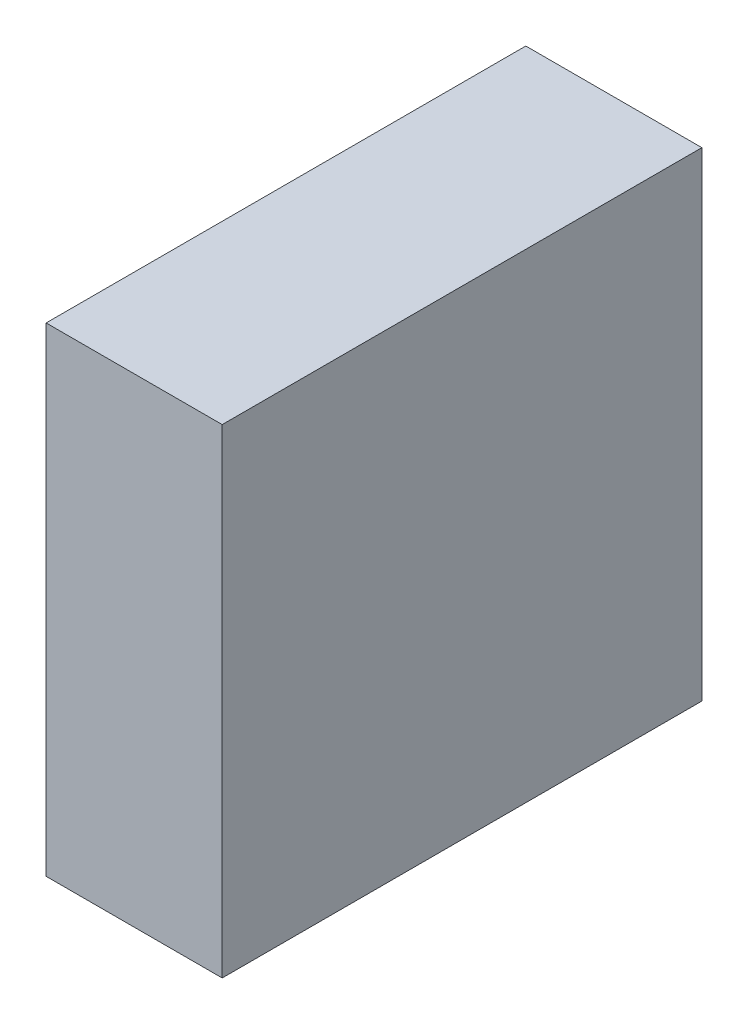
ISO-10303-21;
HEADER;
FILE_DESCRIPTION(('STEP AP214'),'2;1');
FILE_NAME('part.step','',(''),(''),'','','');
FILE_SCHEMA(('AUTOMOTIVE_DESIGN { 1 0 10303 214 1 1 1 1 }'));
ENDSEC;
DATA;
#1=APPLICATION_CONTEXT('core data for automotive mechanical design processes');
#2=APPLICATION_PROTOCOL_DEFINITION('international standard','automotive_design',2000,#1);
#3=PRODUCT_CONTEXT('',#1,'mechanical');
#4=PRODUCT('Part','Part','',(#3));
#5=PRODUCT_RELATED_PRODUCT_CATEGORY('part','',(#4));
#6=PRODUCT_DEFINITION_FORMATION('','',#4);
#7=PRODUCT_DEFINITION_CONTEXT('part definition',#1,'design');
#8=PRODUCT_DEFINITION('design','',#6,#7);
#9=PRODUCT_DEFINITION_SHAPE('','',#8);
#10=(LENGTH_UNIT() NAMED_UNIT(*) SI_UNIT(.MILLI.,.METRE.));
#11=(NAMED_UNIT(*) PLANE_ANGLE_UNIT() SI_UNIT($,.RADIAN.));
#12=(NAMED_UNIT(*) SI_UNIT($,.STERADIAN.) SOLID_ANGLE_UNIT());
#13=UNCERTAINTY_MEASURE_WITH_UNIT(LENGTH_MEASURE(1.E-05),#10,'distance_accuracy_value','');
#14=(GEOMETRIC_REPRESENTATION_CONTEXT(3) GLOBAL_UNCERTAINTY_ASSIGNED_CONTEXT((#13)) GLOBAL_UNIT_ASSIGNED_CONTEXT((#10,
#11,#12)) REPRESENTATION_CONTEXT('',''));
#15=CARTESIAN_POINT('',(0.,0.,0.));
#16=DIRECTION('',(0.,0.,1.));
#17=DIRECTION('',(1.,0.,0.));
#18=AXIS2_PLACEMENT_3D('',#15,#16,#17);
#19=CARTESIAN_POINT('',(1.003,-0.622,0.));
#20=DIRECTION('',(1.,0.,0.));
#21=DIRECTION('',(0.,0.,-1.));
#22=AXIS2_PLACEMENT_3D('',#19,#20,#21);
#23=PLANE('',#22);
#24=DIRECTION('',(0.,1.,0.));
#25=VECTOR('',#24,1.);
#26=CARTESIAN_POINT('',(1.003,-0.622,1.245));
#27=LINE('',#26,#25);
#28=CARTESIAN_POINT('',(1.003,-0.622,1.245));
#29=VERTEX_POINT('',#28);
#30=CARTESIAN_POINT('',(1.003,0.622,1.245));
#31=VERTEX_POINT('',#30);
#32=EDGE_CURVE('E68',#29,#31,#27,.T.);
#33=ORIENTED_EDGE('',*,*,#32,.F.);
#34=DIRECTION('',(0.,0.,-1.));
#35=VECTOR('',#34,1.);
#36=CARTESIAN_POINT('',(1.003,-0.622,0.));
#37=LINE('',#36,#35);
#38=CARTESIAN_POINT('',(1.003,-0.622,0.));
#39=VERTEX_POINT('',#38);
#40=EDGE_CURVE('E55',#39,#29,#37,.F.);
#41=ORIENTED_EDGE('',*,*,#40,.F.);
#42=DIRECTION('',(0.,1.,0.));
#43=VECTOR('',#42,1.);
#44=CARTESIAN_POINT('',(1.003,0.622,0.));
#45=LINE('',#44,#43);
#46=CARTESIAN_POINT('',(1.003,0.622,0.));
#47=VERTEX_POINT('',#46);
#48=EDGE_CURVE('E20',#47,#39,#45,.F.);
#49=ORIENTED_EDGE('',*,*,#48,.F.);
#50=DIRECTION('',(0.,0.,1.));
#51=VECTOR('',#50,1.);
#52=CARTESIAN_POINT('',(1.003,0.622,0.));
#53=LINE('',#52,#51);
#54=EDGE_CURVE('E81',#31,#47,#53,.F.);
#55=ORIENTED_EDGE('',*,*,#54,.F.);
#56=EDGE_LOOP('',(#33,#41,#49,#55));
#57=FACE_BOUND('',#56,.T.);
#58=ADVANCED_FACE('F17',(#57),#23,.T.);
#59=CARTESIAN_POINT('',(0.546,0.622,0.));
#60=DIRECTION('',(0.,0.,-1.));
#61=DIRECTION('',(-1.,0.,0.));
#62=AXIS2_PLACEMENT_3D('',#59,#60,#61);
#63=PLANE('',#62);
#64=DIRECTION('',(1.,0.,0.));
#65=VECTOR('',#64,1.);
#66=CARTESIAN_POINT('',(0.546,-0.622,0.));
#67=LINE('',#66,#65);
#68=CARTESIAN_POINT('',(0.546,-0.622,0.));
#69=VERTEX_POINT('',#68);
#70=EDGE_CURVE('E61',#69,#39,#67,.T.);
#71=ORIENTED_EDGE('',*,*,#70,.F.);
#72=DIRECTION('',(0.,1.,0.));
#73=VECTOR('',#72,1.);
#74=CARTESIAN_POINT('',(0.546,0.622,0.));
#75=LINE('',#74,#73);
#76=CARTESIAN_POINT('',(0.546,0.622,0.));
#77=VERTEX_POINT('',#76);
#78=EDGE_CURVE('E83',#77,#69,#75,.F.);
#79=ORIENTED_EDGE('',*,*,#78,.F.);
#80=DIRECTION('',(1.,0.,0.));
#81=VECTOR('',#80,1.);
#82=CARTESIAN_POINT('',(1.003,0.622,0.));
#83=LINE('',#82,#81);
#84=EDGE_CURVE('E64',#47,#77,#83,.F.);
#85=ORIENTED_EDGE('',*,*,#84,.F.);
#86=ORIENTED_EDGE('',*,*,#48,.T.);
#87=EDGE_LOOP('',(#71,#79,#85,#86));
#88=FACE_BOUND('',#87,.T.);
#89=ADVANCED_FACE('F60',(#88),#63,.T.);
#90=CARTESIAN_POINT('',(0.546,-0.622,0.));
#91=DIRECTION('',(0.,-1.,0.));
#92=DIRECTION('',(0.,0.,-1.));
#93=AXIS2_PLACEMENT_3D('',#90,#91,#92);
#94=PLANE('',#93);
#95=DIRECTION('',(1.,0.,0.));
#96=VECTOR('',#95,1.);
#97=CARTESIAN_POINT('',(0.546,-0.622,1.245));
#98=LINE('',#97,#96);
#99=CARTESIAN_POINT('',(0.546,-0.622,1.245));
#100=VERTEX_POINT('',#99);
#101=EDGE_CURVE('E70',#100,#29,#98,.T.);
#102=ORIENTED_EDGE('',*,*,#101,.F.);
#103=DIRECTION('',(0.,0.,1.));
#104=VECTOR('',#103,1.);
#105=CARTESIAN_POINT('',(0.546,-0.622,0.));
#106=LINE('',#105,#104);
#107=EDGE_CURVE('E74',#69,#100,#106,.T.);
#108=ORIENTED_EDGE('',*,*,#107,.F.);
#109=ORIENTED_EDGE('',*,*,#70,.T.);
#110=ORIENTED_EDGE('',*,*,#40,.T.);
#111=EDGE_LOOP('',(#102,#108,#109,#110));
#112=FACE_BOUND('',#111,.T.);
#113=ADVANCED_FACE('F72',(#112),#94,.T.);
#114=CARTESIAN_POINT('',(0.546,-0.622,1.245));
#115=DIRECTION('',(0.,0.,1.));
#116=DIRECTION('',(1.,0.,0.));
#117=AXIS2_PLACEMENT_3D('',#114,#115,#116);
#118=PLANE('',#117);
#119=DIRECTION('',(1.,0.,0.));
#120=VECTOR('',#119,1.);
#121=CARTESIAN_POINT('',(1.003,0.622,1.245));
#122=LINE('',#121,#120);
#123=CARTESIAN_POINT('',(0.546,0.622,1.245));
#124=VERTEX_POINT('',#123);
#125=EDGE_CURVE('E35',#124,#31,#122,.T.);
#126=ORIENTED_EDGE('',*,*,#125,.F.);
#127=DIRECTION('',(0.,1.,0.));
#128=VECTOR('',#127,1.);
#129=CARTESIAN_POINT('',(0.546,0.622,1.245));
#130=LINE('',#129,#128);
#131=EDGE_CURVE('E26',#100,#124,#130,.T.);
#132=ORIENTED_EDGE('',*,*,#131,.F.);
#133=ORIENTED_EDGE('',*,*,#101,.T.);
#134=ORIENTED_EDGE('',*,*,#32,.T.);
#135=EDGE_LOOP('',(#126,#132,#133,#134));
#136=FACE_BOUND('',#135,.T.);
#137=ADVANCED_FACE('F89',(#136),#118,.T.);
#138=CARTESIAN_POINT('',(1.003,0.622,0.));
#139=DIRECTION('',(0.,1.,0.));
#140=DIRECTION('',(0.,0.,1.));
#141=AXIS2_PLACEMENT_3D('',#138,#139,#140);
#142=PLANE('',#141);
#143=ORIENTED_EDGE('',*,*,#125,.T.);
#144=ORIENTED_EDGE('',*,*,#54,.T.);
#145=ORIENTED_EDGE('',*,*,#84,.T.);
#146=DIRECTION('',(0.,0.,1.));
#147=VECTOR('',#146,1.);
#148=CARTESIAN_POINT('',(0.546,0.622,0.));
#149=LINE('',#148,#147);
#150=EDGE_CURVE('E11',#124,#77,#149,.F.);
#151=ORIENTED_EDGE('',*,*,#150,.F.);
#152=EDGE_LOOP('',(#143,#144,#145,#151));
#153=FACE_BOUND('',#152,.T.);
#154=ADVANCED_FACE('F91',(#153),#142,.T.);
#155=CARTESIAN_POINT('',(0.546,0.622,0.));
#156=DIRECTION('',(-1.,0.,0.));
#157=DIRECTION('',(0.,0.,1.));
#158=AXIS2_PLACEMENT_3D('',#155,#156,#157);
#159=PLANE('',#158);
#160=ORIENTED_EDGE('',*,*,#131,.T.);
#161=ORIENTED_EDGE('',*,*,#150,.T.);
#162=ORIENTED_EDGE('',*,*,#78,.T.);
#163=ORIENTED_EDGE('',*,*,#107,.T.);
#164=EDGE_LOOP('',(#160,#161,#162,#163));
#165=FACE_BOUND('',#164,.T.);
#166=ADVANCED_FACE('F88',(#165),#159,.T.);
#167=CLOSED_SHELL('',(#58,#89,#113,#137,#154,#166));
#168=MANIFOLD_SOLID_BREP('B1',#167);
#169=ADVANCED_BREP_SHAPE_REPRESENTATION('',(#18,#168),#14);
#170=SHAPE_DEFINITION_REPRESENTATION(#9,#169);
ENDSEC;
END-ISO-10303-21;
